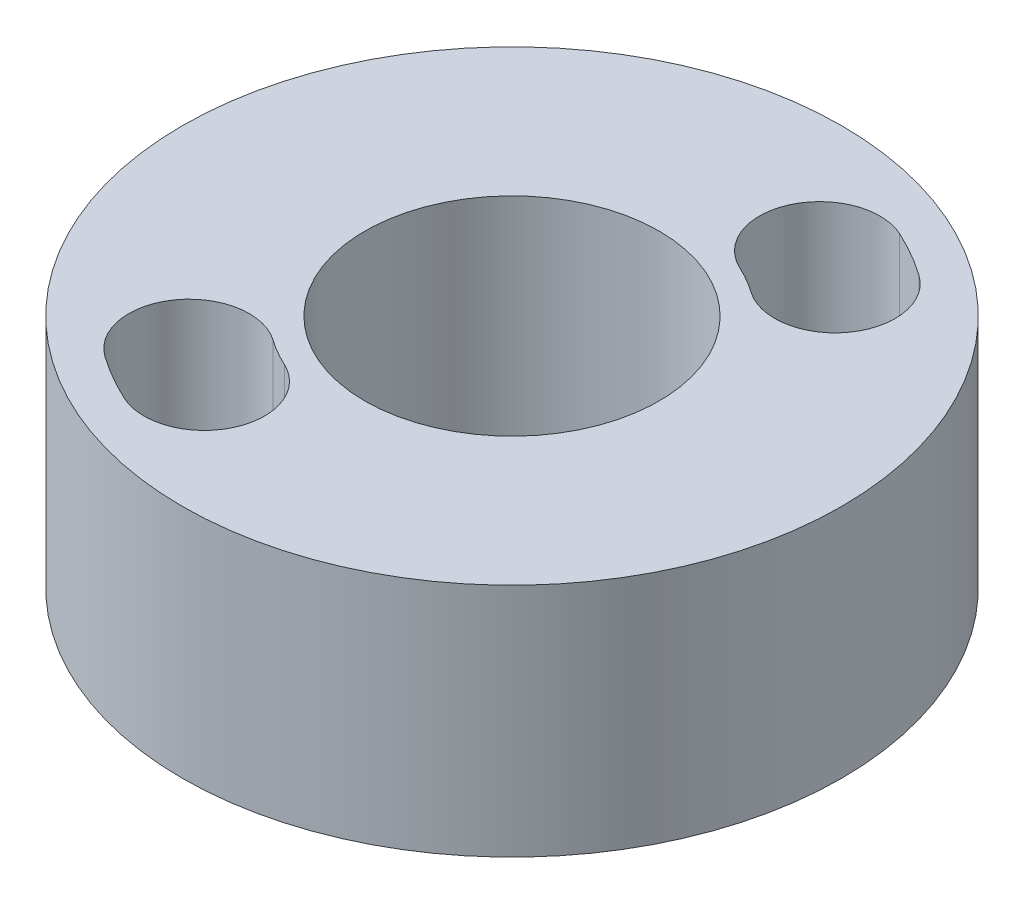
ISO-10303-21;
HEADER;
FILE_DESCRIPTION(('STEP AP214'),'2;1');
FILE_NAME('part.step','',(''),(''),'','','');
FILE_SCHEMA(('AUTOMOTIVE_DESIGN { 1 0 10303 214 1 1 1 1 }'));
ENDSEC;
DATA;
#1=APPLICATION_CONTEXT('core data for automotive mechanical design processes');
#2=APPLICATION_PROTOCOL_DEFINITION('international standard','automotive_design',2000,#1);
#3=PRODUCT_CONTEXT('',#1,'mechanical');
#4=PRODUCT('Part','Part','',(#3));
#5=PRODUCT_RELATED_PRODUCT_CATEGORY('part','',(#4));
#6=PRODUCT_DEFINITION_FORMATION('','',#4);
#7=PRODUCT_DEFINITION_CONTEXT('part definition',#1,'design');
#8=PRODUCT_DEFINITION('design','',#6,#7);
#9=PRODUCT_DEFINITION_SHAPE('','',#8);
#10=(LENGTH_UNIT() NAMED_UNIT(*) SI_UNIT(.MILLI.,.METRE.));
#11=(NAMED_UNIT(*) PLANE_ANGLE_UNIT() SI_UNIT($,.RADIAN.));
#12=(NAMED_UNIT(*) SI_UNIT($,.STERADIAN.) SOLID_ANGLE_UNIT());
#13=UNCERTAINTY_MEASURE_WITH_UNIT(LENGTH_MEASURE(1.E-05),#10,'distance_accuracy_value','');
#14=(GEOMETRIC_REPRESENTATION_CONTEXT(3) GLOBAL_UNCERTAINTY_ASSIGNED_CONTEXT((#13)) GLOBAL_UNIT_ASSIGNED_CONTEXT((#10,
#11,#12)) REPRESENTATION_CONTEXT('',''));
#15=CARTESIAN_POINT('',(0.,0.,0.));
#16=DIRECTION('',(0.,0.,1.));
#17=DIRECTION('',(1.,0.,0.));
#18=AXIS2_PLACEMENT_3D('',#15,#16,#17);
#19=CARTESIAN_POINT('',(0.,12.7,0.));
#20=DIRECTION('',(0.,1.,0.));
#21=DIRECTION('',(0.,0.,1.));
#22=AXIS2_PLACEMENT_3D('',#19,#20,#21);
#23=PLANE('',#22);
#24=CARTESIAN_POINT('',(5.25,12.7,-11.3440513045384));
#25=DIRECTION('',(0.,1.,0.));
#26=DIRECTION('',(0.,0.,1.));
#27=AXIS2_PLACEMENT_3D('',#24,#25,#26);
#28=CIRCLE('',#27,3.25);
#29=CARTESIAN_POINT('',(6.615,12.7,-14.2935046437184));
#30=VERTEX_POINT('',#29);
#31=CARTESIAN_POINT('',(3.885,12.7,-8.39459796535844));
#32=VERTEX_POINT('',#31);
#33=EDGE_CURVE('E136',#30,#32,#28,.T.);
#34=ORIENTED_EDGE('',*,*,#33,.F.);
#35=CARTESIAN_POINT('',(0.,12.7,0.));
#36=DIRECTION('',(0.,1.,0.));
#37=DIRECTION('',(0.,0.,-1.));
#38=AXIS2_PLACEMENT_3D('',#35,#36,#37);
#39=CIRCLE('',#38,15.75);
#40=CARTESIAN_POINT('',(9.07103813057102,12.7,-12.8755103678933));
#41=VERTEX_POINT('',#40);
#42=EDGE_CURVE('E144',#41,#30,#39,.T.);
#43=ORIENTED_EDGE('',*,*,#42,.F.);
#44=CARTESIAN_POINT('',(7.19923661156431,12.7,-10.2186590221375));
#45=DIRECTION('',(0.,1.,0.));
#46=DIRECTION('',(0.,0.,-1.));
#47=AXIS2_PLACEMENT_3D('',#44,#45,#46);
#48=CIRCLE('',#47,3.25);
#49=CARTESIAN_POINT('',(5.32743509255759,12.7,-7.56180767638175));
#50=VERTEX_POINT('',#49);
#51=EDGE_CURVE('E158',#50,#41,#48,.T.);
#52=ORIENTED_EDGE('',*,*,#51,.F.);
#53=CARTESIAN_POINT('',(0.,12.7,0.));
#54=DIRECTION('',(0.,-1.,0.));
#55=DIRECTION('',(0.,0.,-1.));
#56=AXIS2_PLACEMENT_3D('',#53,#54,#55);
#57=CIRCLE('',#56,9.25);
#58=EDGE_CURVE('E155',#32,#50,#57,.T.);
#59=ORIENTED_EDGE('',*,*,#58,.F.);
#60=EDGE_LOOP('',(#34,#43,#52,#59));
#61=FACE_BOUND('',#60,.T.);
#62=CARTESIAN_POINT('',(0.,12.7,0.));
#63=DIRECTION('',(0.,1.,0.));
#64=DIRECTION('',(0.,0.,1.));
#65=AXIS2_PLACEMENT_3D('',#62,#63,#64);
#66=CIRCLE('',#65,17.78);
#67=CARTESIAN_POINT('',(0.,12.7,17.78));
#68=VERTEX_POINT('',#67);
#69=EDGE_CURVE('E11',#68,#68,#66,.T.);
#70=ORIENTED_EDGE('',*,*,#69,.T.);
#71=EDGE_LOOP('',(#70));
#72=FACE_BOUND('',#71,.T.);
#73=CARTESIAN_POINT('',(0.,12.7,0.));
#74=DIRECTION('',(0.,1.,0.));
#75=DIRECTION('',(0.,0.,1.));
#76=AXIS2_PLACEMENT_3D('',#73,#74,#75);
#77=CIRCLE('',#76,7.9375);
#78=CARTESIAN_POINT('',(0.,12.7,7.9375));
#79=VERTEX_POINT('',#78);
#80=EDGE_CURVE('E172',#79,#79,#77,.T.);
#81=ORIENTED_EDGE('',*,*,#80,.F.);
#82=EDGE_LOOP('',(#81));
#83=FACE_BOUND('',#82,.T.);
#84=CARTESIAN_POINT('',(-5.25,12.7,11.3440513045384));
#85=DIRECTION('',(0.,1.,0.));
#86=DIRECTION('',(0.,0.,-1.));
#87=AXIS2_PLACEMENT_3D('',#84,#85,#86);
#88=CIRCLE('',#87,3.25);
#89=CARTESIAN_POINT('',(-6.615,12.7,14.2935046437184));
#90=VERTEX_POINT('',#89);
#91=CARTESIAN_POINT('',(-3.885,12.7,8.39459796535844));
#92=VERTEX_POINT('',#91);
#93=EDGE_CURVE('E54',#90,#92,#88,.T.);
#94=ORIENTED_EDGE('',*,*,#93,.F.);
#95=CARTESIAN_POINT('',(0.,12.7,0.));
#96=DIRECTION('',(0.,1.,0.));
#97=DIRECTION('',(0.,0.,1.));
#98=AXIS2_PLACEMENT_3D('',#95,#96,#97);
#99=CIRCLE('',#98,15.75);
#100=CARTESIAN_POINT('',(-9.07103813057102,12.7,12.8755103678933));
#101=VERTEX_POINT('',#100);
#102=EDGE_CURVE('E121',#101,#90,#99,.T.);
#103=ORIENTED_EDGE('',*,*,#102,.F.);
#104=CARTESIAN_POINT('',(-7.19923661156431,12.7,10.2186590221375));
#105=DIRECTION('',(0.,1.,0.));
#106=DIRECTION('',(0.,0.,1.));
#107=AXIS2_PLACEMENT_3D('',#104,#105,#106);
#108=CIRCLE('',#107,3.25);
#109=CARTESIAN_POINT('',(-5.32743509255759,12.7,7.56180767638175));
#110=VERTEX_POINT('',#109);
#111=EDGE_CURVE('E124',#110,#101,#108,.T.);
#112=ORIENTED_EDGE('',*,*,#111,.F.);
#113=CARTESIAN_POINT('',(0.,12.7,0.));
#114=DIRECTION('',(0.,-1.,0.));
#115=DIRECTION('',(0.,0.,1.));
#116=AXIS2_PLACEMENT_3D('',#113,#114,#115);
#117=CIRCLE('',#116,9.25);
#118=EDGE_CURVE('E130',#92,#110,#117,.T.);
#119=ORIENTED_EDGE('',*,*,#118,.F.);
#120=EDGE_LOOP('',(#94,#103,#112,#119));
#121=FACE_BOUND('',#120,.T.);
#122=ADVANCED_FACE('F39',(#61,#72,#83,#121),#23,.T.);
#123=CARTESIAN_POINT('',(0.,0.,0.));
#124=DIRECTION('',(0.,1.,0.));
#125=DIRECTION('',(0.,0.,1.));
#126=AXIS2_PLACEMENT_3D('',#123,#124,#125);
#127=PLANE('',#126);
#128=CARTESIAN_POINT('',(0.,0.,0.));
#129=DIRECTION('',(0.,1.,0.));
#130=DIRECTION('',(0.,0.,1.));
#131=AXIS2_PLACEMENT_3D('',#128,#129,#130);
#132=CIRCLE('',#131,17.78);
#133=CARTESIAN_POINT('',(0.,0.,17.78));
#134=VERTEX_POINT('',#133);
#135=EDGE_CURVE('E43',#134,#134,#132,.T.);
#136=ORIENTED_EDGE('',*,*,#135,.F.);
#137=EDGE_LOOP('',(#136));
#138=FACE_BOUND('',#137,.T.);
#139=CARTESIAN_POINT('',(0.,0.,0.));
#140=DIRECTION('',(0.,1.,0.));
#141=DIRECTION('',(0.,0.,1.));
#142=AXIS2_PLACEMENT_3D('',#139,#140,#141);
#143=CIRCLE('',#142,7.9375);
#144=CARTESIAN_POINT('',(0.,0.,7.9375));
#145=VERTEX_POINT('',#144);
#146=EDGE_CURVE('E165',#145,#145,#143,.T.);
#147=ORIENTED_EDGE('',*,*,#146,.T.);
#148=EDGE_LOOP('',(#147));
#149=FACE_BOUND('',#148,.T.);
#150=CARTESIAN_POINT('',(0.,0.,0.));
#151=DIRECTION('',(0.,1.,0.));
#152=DIRECTION('',(0.,0.,-1.));
#153=AXIS2_PLACEMENT_3D('',#150,#151,#152);
#154=CIRCLE('',#153,15.75);
#155=CARTESIAN_POINT('',(9.07103813057102,0.,-12.8755103678933));
#156=VERTEX_POINT('',#155);
#157=CARTESIAN_POINT('',(6.615,0.,-14.2935046437184));
#158=VERTEX_POINT('',#157);
#159=EDGE_CURVE('E150',#156,#158,#154,.T.);
#160=ORIENTED_EDGE('',*,*,#159,.T.);
#161=CARTESIAN_POINT('',(5.25,0.,-11.3440513045384));
#162=DIRECTION('',(0.,1.,0.));
#163=DIRECTION('',(0.,0.,1.));
#164=AXIS2_PLACEMENT_3D('',#161,#162,#163);
#165=CIRCLE('',#164,3.25);
#166=CARTESIAN_POINT('',(3.885,0.,-8.39459796535844));
#167=VERTEX_POINT('',#166);
#168=EDGE_CURVE('E140',#158,#167,#165,.T.);
#169=ORIENTED_EDGE('',*,*,#168,.T.);
#170=CARTESIAN_POINT('',(0.,0.,0.));
#171=DIRECTION('',(0.,-1.,0.));
#172=DIRECTION('',(0.,0.,-1.));
#173=AXIS2_PLACEMENT_3D('',#170,#171,#172);
#174=CIRCLE('',#173,9.25);
#175=CARTESIAN_POINT('',(5.32743509255759,0.,-7.56180767638175));
#176=VERTEX_POINT('',#175);
#177=EDGE_CURVE('E143',#167,#176,#174,.T.);
#178=ORIENTED_EDGE('',*,*,#177,.T.);
#179=CARTESIAN_POINT('',(7.19923661156431,0.,-10.2186590221375));
#180=DIRECTION('',(0.,1.,0.));
#181=DIRECTION('',(0.,0.,-1.));
#182=AXIS2_PLACEMENT_3D('',#179,#180,#181);
#183=CIRCLE('',#182,3.25);
#184=EDGE_CURVE('E147',#176,#156,#183,.T.);
#185=ORIENTED_EDGE('',*,*,#184,.T.);
#186=EDGE_LOOP('',(#160,#169,#178,#185));
#187=FACE_BOUND('',#186,.T.);
#188=CARTESIAN_POINT('',(0.,0.,0.));
#189=DIRECTION('',(0.,1.,0.));
#190=DIRECTION('',(0.,0.,1.));
#191=AXIS2_PLACEMENT_3D('',#188,#189,#190);
#192=CIRCLE('',#191,15.75);
#193=CARTESIAN_POINT('',(-9.07103813057102,0.,12.8755103678933));
#194=VERTEX_POINT('',#193);
#195=CARTESIAN_POINT('',(-6.615,0.,14.2935046437184));
#196=VERTEX_POINT('',#195);
#197=EDGE_CURVE('E112',#194,#196,#192,.T.);
#198=ORIENTED_EDGE('',*,*,#197,.T.);
#199=CARTESIAN_POINT('',(-5.25,0.,11.3440513045384));
#200=DIRECTION('',(0.,1.,0.));
#201=DIRECTION('',(0.,0.,-1.));
#202=AXIS2_PLACEMENT_3D('',#199,#200,#201);
#203=CIRCLE('',#202,3.25);
#204=CARTESIAN_POINT('',(-3.885,0.,8.39459796535844));
#205=VERTEX_POINT('',#204);
#206=EDGE_CURVE('E106',#196,#205,#203,.T.);
#207=ORIENTED_EDGE('',*,*,#206,.T.);
#208=CARTESIAN_POINT('',(0.,0.,0.));
#209=DIRECTION('',(0.,-1.,0.));
#210=DIRECTION('',(0.,0.,1.));
#211=AXIS2_PLACEMENT_3D('',#208,#209,#210);
#212=CIRCLE('',#211,9.25);
#213=CARTESIAN_POINT('',(-5.32743509255759,0.,7.56180767638175));
#214=VERTEX_POINT('',#213);
#215=EDGE_CURVE('E115',#205,#214,#212,.T.);
#216=ORIENTED_EDGE('',*,*,#215,.T.);
#217=CARTESIAN_POINT('',(-7.19923661156431,0.,10.2186590221375));
#218=DIRECTION('',(0.,1.,0.));
#219=DIRECTION('',(0.,0.,1.));
#220=AXIS2_PLACEMENT_3D('',#217,#218,#219);
#221=CIRCLE('',#220,3.25);
#222=EDGE_CURVE('E62',#214,#194,#221,.T.);
#223=ORIENTED_EDGE('',*,*,#222,.T.);
#224=EDGE_LOOP('',(#198,#207,#216,#223));
#225=FACE_BOUND('',#224,.T.);
#226=ADVANCED_FACE('F119',(#138,#149,#187,#225),#127,.F.);
#227=CARTESIAN_POINT('',(0.,12.7,0.));
#228=DIRECTION('',(0.,-1.,0.));
#229=DIRECTION('',(0.,0.,-1.));
#230=AXIS2_PLACEMENT_3D('',#227,#228,#229);
#231=CYLINDRICAL_SURFACE('',#230,17.78);
#232=ORIENTED_EDGE('',*,*,#69,.F.);
#233=EDGE_LOOP('',(#232));
#234=FACE_BOUND('',#233,.T.);
#235=ORIENTED_EDGE('',*,*,#135,.T.);
#236=EDGE_LOOP('',(#235));
#237=FACE_BOUND('',#236,.T.);
#238=ADVANCED_FACE('F41',(#234,#237),#231,.T.);
#239=CARTESIAN_POINT('',(0.,12.7,0.));
#240=DIRECTION('',(0.,-1.,0.));
#241=DIRECTION('',(0.,0.,-1.));
#242=AXIS2_PLACEMENT_3D('',#239,#240,#241);
#243=CYLINDRICAL_SURFACE('',#242,7.9375);
#244=ORIENTED_EDGE('',*,*,#80,.T.);
#245=EDGE_LOOP('',(#244));
#246=FACE_BOUND('',#245,.T.);
#247=ORIENTED_EDGE('',*,*,#146,.F.);
#248=EDGE_LOOP('',(#247));
#249=FACE_BOUND('',#248,.T.);
#250=ADVANCED_FACE('F180',(#246,#249),#243,.F.);
#251=CARTESIAN_POINT('',(5.25,0.,-11.3440513045384));
#252=DIRECTION('',(0.,1.,0.));
#253=DIRECTION('',(0.,0.,1.));
#254=AXIS2_PLACEMENT_3D('',#251,#252,#253);
#255=CYLINDRICAL_SURFACE('',#254,3.25);
#256=ORIENTED_EDGE('',*,*,#33,.T.);
#257=DIRECTION('',(0.,1.,0.));
#258=VECTOR('',#257,1.);
#259=CARTESIAN_POINT('',(3.885,0.,-8.39459796535844));
#260=LINE('',#259,#258);
#261=EDGE_CURVE('E153',#167,#32,#260,.T.);
#262=ORIENTED_EDGE('',*,*,#261,.F.);
#263=ORIENTED_EDGE('',*,*,#168,.F.);
#264=DIRECTION('',(0.,1.,0.));
#265=VECTOR('',#264,1.);
#266=CARTESIAN_POINT('',(6.615,0.,-14.2935046437184));
#267=LINE('',#266,#265);
#268=EDGE_CURVE('E163',#158,#30,#267,.T.);
#269=ORIENTED_EDGE('',*,*,#268,.T.);
#270=EDGE_LOOP('',(#256,#262,#263,#269));
#271=FACE_BOUND('',#270,.T.);
#272=ADVANCED_FACE('F182',(#271),#255,.F.);
#273=CARTESIAN_POINT('',(0.,0.,0.));
#274=DIRECTION('',(0.,1.,0.));
#275=DIRECTION('',(0.,0.,1.));
#276=AXIS2_PLACEMENT_3D('',#273,#274,#275);
#277=CYLINDRICAL_SURFACE('',#276,15.75);
#278=ORIENTED_EDGE('',*,*,#42,.T.);
#279=ORIENTED_EDGE('',*,*,#268,.F.);
#280=ORIENTED_EDGE('',*,*,#159,.F.);
#281=DIRECTION('',(0.,1.,0.));
#282=VECTOR('',#281,1.);
#283=CARTESIAN_POINT('',(9.07103813057102,0.,-12.8755103678933));
#284=LINE('',#283,#282);
#285=EDGE_CURVE('E166',#156,#41,#284,.T.);
#286=ORIENTED_EDGE('',*,*,#285,.T.);
#287=EDGE_LOOP('',(#278,#279,#280,#286));
#288=FACE_BOUND('',#287,.T.);
#289=ADVANCED_FACE('F189',(#288),#277,.F.);
#290=CARTESIAN_POINT('',(7.19923661156431,0.,-10.2186590221375));
#291=DIRECTION('',(0.,1.,0.));
#292=DIRECTION('',(0.,0.,1.));
#293=AXIS2_PLACEMENT_3D('',#290,#291,#292);
#294=CYLINDRICAL_SURFACE('',#293,3.25);
#295=ORIENTED_EDGE('',*,*,#51,.T.);
#296=ORIENTED_EDGE('',*,*,#285,.F.);
#297=ORIENTED_EDGE('',*,*,#184,.F.);
#298=DIRECTION('',(0.,1.,0.));
#299=VECTOR('',#298,1.);
#300=CARTESIAN_POINT('',(5.32743509255759,0.,-7.56180767638175));
#301=LINE('',#300,#299);
#302=EDGE_CURVE('E168',#176,#50,#301,.T.);
#303=ORIENTED_EDGE('',*,*,#302,.T.);
#304=EDGE_LOOP('',(#295,#296,#297,#303));
#305=FACE_BOUND('',#304,.T.);
#306=ADVANCED_FACE('F227',(#305),#294,.F.);
#307=CARTESIAN_POINT('',(0.,0.,0.));
#308=DIRECTION('',(0.,1.,0.));
#309=DIRECTION('',(0.,0.,1.));
#310=AXIS2_PLACEMENT_3D('',#307,#308,#309);
#311=CYLINDRICAL_SURFACE('',#310,9.25);
#312=ORIENTED_EDGE('',*,*,#58,.T.);
#313=ORIENTED_EDGE('',*,*,#302,.F.);
#314=ORIENTED_EDGE('',*,*,#177,.F.);
#315=ORIENTED_EDGE('',*,*,#261,.T.);
#316=EDGE_LOOP('',(#312,#313,#314,#315));
#317=FACE_BOUND('',#316,.T.);
#318=ADVANCED_FACE('F220',(#317),#311,.T.);
#319=CARTESIAN_POINT('',(-5.25,0.,11.3440513045384));
#320=DIRECTION('',(0.,1.,0.));
#321=DIRECTION('',(0.,0.,1.));
#322=AXIS2_PLACEMENT_3D('',#319,#320,#321);
#323=CYLINDRICAL_SURFACE('',#322,3.25);
#324=ORIENTED_EDGE('',*,*,#93,.T.);
#325=DIRECTION('',(0.,1.,0.));
#326=VECTOR('',#325,1.);
#327=CARTESIAN_POINT('',(-3.885,0.,8.39459796535844));
#328=LINE('',#327,#326);
#329=EDGE_CURVE('E102',#205,#92,#328,.T.);
#330=ORIENTED_EDGE('',*,*,#329,.F.);
#331=ORIENTED_EDGE('',*,*,#206,.F.);
#332=DIRECTION('',(0.,1.,0.));
#333=VECTOR('',#332,1.);
#334=CARTESIAN_POINT('',(-6.615,0.,14.2935046437184));
#335=LINE('',#334,#333);
#336=EDGE_CURVE('E134',#196,#90,#335,.T.);
#337=ORIENTED_EDGE('',*,*,#336,.T.);
#338=EDGE_LOOP('',(#324,#330,#331,#337));
#339=FACE_BOUND('',#338,.T.);
#340=ADVANCED_FACE('F104',(#339),#323,.F.);
#341=CARTESIAN_POINT('',(0.,0.,0.));
#342=DIRECTION('',(0.,1.,0.));
#343=DIRECTION('',(0.,0.,1.));
#344=AXIS2_PLACEMENT_3D('',#341,#342,#343);
#345=CYLINDRICAL_SURFACE('',#344,15.75);
#346=ORIENTED_EDGE('',*,*,#102,.T.);
#347=ORIENTED_EDGE('',*,*,#336,.F.);
#348=ORIENTED_EDGE('',*,*,#197,.F.);
#349=DIRECTION('',(0.,1.,0.));
#350=VECTOR('',#349,1.);
#351=CARTESIAN_POINT('',(-9.07103813057102,0.,12.8755103678933));
#352=LINE('',#351,#350);
#353=EDGE_CURVE('E137',#194,#101,#352,.T.);
#354=ORIENTED_EDGE('',*,*,#353,.T.);
#355=EDGE_LOOP('',(#346,#347,#348,#354));
#356=FACE_BOUND('',#355,.T.);
#357=ADVANCED_FACE('F212',(#356),#345,.F.);
#358=CARTESIAN_POINT('',(-7.19923661156431,0.,10.2186590221375));
#359=DIRECTION('',(0.,1.,0.));
#360=DIRECTION('',(0.,0.,1.));
#361=AXIS2_PLACEMENT_3D('',#358,#359,#360);
#362=CYLINDRICAL_SURFACE('',#361,3.25);
#363=ORIENTED_EDGE('',*,*,#111,.T.);
#364=ORIENTED_EDGE('',*,*,#353,.F.);
#365=ORIENTED_EDGE('',*,*,#222,.F.);
#366=DIRECTION('',(0.,1.,0.));
#367=VECTOR('',#366,1.);
#368=CARTESIAN_POINT('',(-5.32743509255759,0.,7.56180767638175));
#369=LINE('',#368,#367);
#370=EDGE_CURVE('E111',#214,#110,#369,.T.);
#371=ORIENTED_EDGE('',*,*,#370,.T.);
#372=EDGE_LOOP('',(#363,#364,#365,#371));
#373=FACE_BOUND('',#372,.T.);
#374=ADVANCED_FACE('F210',(#373),#362,.F.);
#375=CARTESIAN_POINT('',(0.,0.,0.));
#376=DIRECTION('',(0.,1.,0.));
#377=DIRECTION('',(0.,0.,1.));
#378=AXIS2_PLACEMENT_3D('',#375,#376,#377);
#379=CYLINDRICAL_SURFACE('',#378,9.25);
#380=ORIENTED_EDGE('',*,*,#118,.T.);
#381=ORIENTED_EDGE('',*,*,#370,.F.);
#382=ORIENTED_EDGE('',*,*,#215,.F.);
#383=ORIENTED_EDGE('',*,*,#329,.T.);
#384=EDGE_LOOP('',(#380,#381,#382,#383));
#385=FACE_BOUND('',#384,.T.);
#386=ADVANCED_FACE('F116',(#385),#379,.T.);
#387=CLOSED_SHELL('',(#122,#226,#238,#250,#272,#289,#306,#318,#340,#357,#374,#386));
#388=MANIFOLD_SOLID_BREP('B2',#387);
#389=ADVANCED_BREP_SHAPE_REPRESENTATION('',(#18,#388),#14);
#390=SHAPE_DEFINITION_REPRESENTATION(#9,#389);
ENDSEC;
END-ISO-10303-21;
